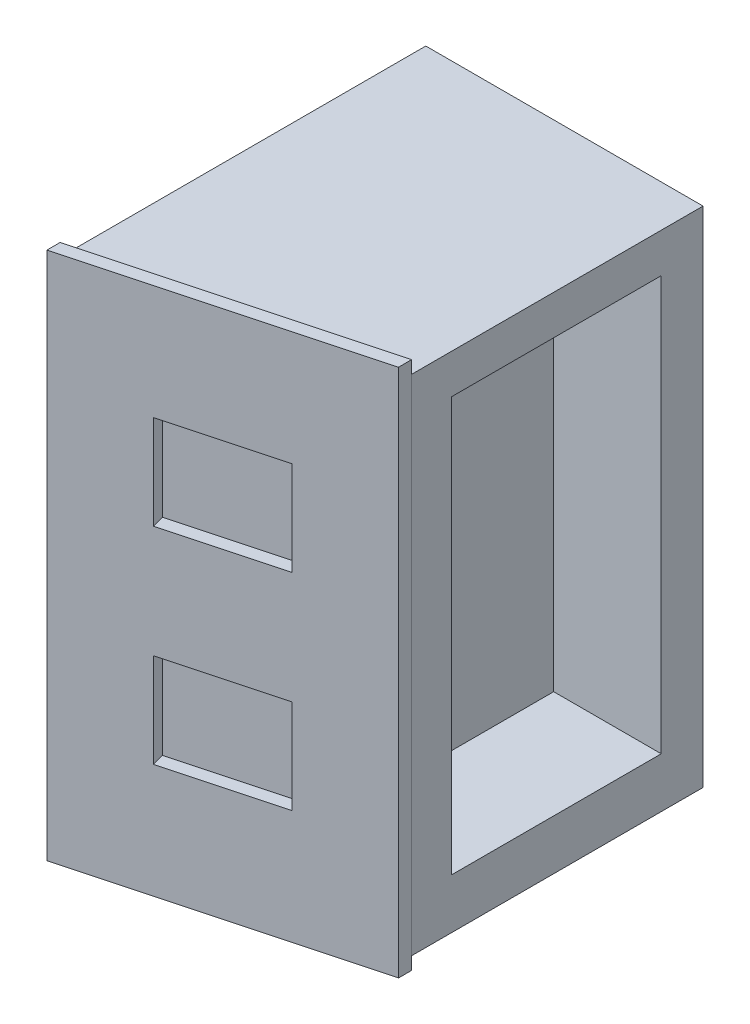
ISO-10303-21;
HEADER;
FILE_DESCRIPTION(('STEP AP214'),'2;1');
FILE_NAME('part.step','',(''),(''),'','','');
FILE_SCHEMA(('AUTOMOTIVE_DESIGN { 1 0 10303 214 1 1 1 1 }'));
ENDSEC;
DATA;
#1=APPLICATION_CONTEXT('core data for automotive mechanical design processes');
#2=APPLICATION_PROTOCOL_DEFINITION('international standard','automotive_design',2000,#1);
#3=PRODUCT_CONTEXT('',#1,'mechanical');
#4=PRODUCT('Part','Part','',(#3));
#5=PRODUCT_RELATED_PRODUCT_CATEGORY('part','',(#4));
#6=PRODUCT_DEFINITION_FORMATION('','',#4);
#7=PRODUCT_DEFINITION_CONTEXT('part definition',#1,'design');
#8=PRODUCT_DEFINITION('design','',#6,#7);
#9=PRODUCT_DEFINITION_SHAPE('','',#8);
#10=(LENGTH_UNIT() NAMED_UNIT(*) SI_UNIT(.MILLI.,.METRE.));
#11=(NAMED_UNIT(*) PLANE_ANGLE_UNIT() SI_UNIT($,.RADIAN.));
#12=(NAMED_UNIT(*) SI_UNIT($,.STERADIAN.) SOLID_ANGLE_UNIT());
#13=UNCERTAINTY_MEASURE_WITH_UNIT(LENGTH_MEASURE(1.E-05),#10,'distance_accuracy_value','');
#14=(GEOMETRIC_REPRESENTATION_CONTEXT(3) GLOBAL_UNCERTAINTY_ASSIGNED_CONTEXT((#13)) GLOBAL_UNIT_ASSIGNED_CONTEXT((#10,
#11,#12)) REPRESENTATION_CONTEXT('',''));
#15=CARTESIAN_POINT('',(0.,0.,0.));
#16=DIRECTION('',(0.,0.,1.));
#17=DIRECTION('',(1.,0.,0.));
#18=AXIS2_PLACEMENT_3D('',#15,#16,#17);
#19=CARTESIAN_POINT('',(148.067024085552,0.,552.59365681282));
#20=DIRECTION('',(-0.258819045102514,0.,-0.96592582628907));
#21=DIRECTION('',(-0.96592582628907,0.,0.258819045102514));
#22=AXIS2_PLACEMENT_3D('',#19,#20,#21);
#23=PLANE('',#22);
#24=DIRECTION('',(0.96592582628907,0.,-0.258819045102514));
#25=VECTOR('',#24,1.);
#26=CARTESIAN_POINT('',(-98.9844541522319,31.6458753119341,618.790900895548));
#27=LINE('',#26,#25);
#28=CARTESIAN_POINT('',(-227.790663087879,31.6458753119341,653.304420559968));
#29=VERTEX_POINT('',#28);
#30=CARTESIAN_POINT('',(-98.9844541522319,31.6458753119341,618.790900895548));
#31=VERTEX_POINT('',#30);
#32=EDGE_CURVE('E178',#29,#31,#27,.T.);
#33=ORIENTED_EDGE('',*,*,#32,.F.);
#34=DIRECTION('',(0.,-1.,0.));
#35=VECTOR('',#34,1.);
#36=CARTESIAN_POINT('',(-227.790663087879,31.6458753119341,653.304420559968));
#37=LINE('',#36,#35);
#38=CARTESIAN_POINT('',(-227.790663087879,142.770875311934,653.304420559968));
#39=VERTEX_POINT('',#38);
#40=EDGE_CURVE('E69',#39,#29,#37,.T.);
#41=ORIENTED_EDGE('',*,*,#40,.F.);
#42=DIRECTION('',(-0.96592582628907,0.,0.258819045102514));
#43=VECTOR('',#42,1.);
#44=CARTESIAN_POINT('',(-98.9844541522319,142.770875311934,618.790900895548));
#45=LINE('',#44,#43);
#46=CARTESIAN_POINT('',(-98.9844541522319,142.770875311934,618.790900895548));
#47=VERTEX_POINT('',#46);
#48=EDGE_CURVE('E165',#47,#39,#45,.T.);
#49=ORIENTED_EDGE('',*,*,#48,.F.);
#50=DIRECTION('',(0.,1.,0.));
#51=VECTOR('',#50,1.);
#52=CARTESIAN_POINT('',(-98.9844541522319,31.6458753119341,618.790900895548));
#53=LINE('',#52,#51);
#54=EDGE_CURVE('E169',#31,#47,#53,.T.);
#55=ORIENTED_EDGE('',*,*,#54,.F.);
#56=EDGE_LOOP('',(#33,#41,#49,#55));
#57=FACE_BOUND('',#56,.T.);
#58=DIRECTION('',(0.,-1.,0.));
#59=VECTOR('',#58,1.);
#60=CARTESIAN_POINT('',(-227.790663087879,386.381153049981,653.304420559968));
#61=LINE('',#60,#59);
#62=CARTESIAN_POINT('',(-227.790663087879,386.381153049981,653.304420559968));
#63=VERTEX_POINT('',#62);
#64=CARTESIAN_POINT('',(-227.790663087879,275.256153049981,653.304420559968));
#65=VERTEX_POINT('',#64);
#66=EDGE_CURVE('E214',#63,#65,#61,.T.);
#67=ORIENTED_EDGE('',*,*,#66,.F.);
#68=DIRECTION('',(-0.96592582628907,0.,0.258819045102514));
#69=VECTOR('',#68,1.);
#70=CARTESIAN_POINT('',(-98.9844541522319,386.381153049981,618.790900895548));
#71=LINE('',#70,#69);
#72=CARTESIAN_POINT('',(-98.9844541522319,386.381153049981,618.790900895548));
#73=VERTEX_POINT('',#72);
#74=EDGE_CURVE('E77',#73,#63,#71,.T.);
#75=ORIENTED_EDGE('',*,*,#74,.F.);
#76=DIRECTION('',(0.,1.,0.));
#77=VECTOR('',#76,1.);
#78=CARTESIAN_POINT('',(-98.9844541522319,386.381153049981,618.790900895548));
#79=LINE('',#78,#77);
#80=CARTESIAN_POINT('',(-98.9844541522319,275.256153049981,618.790900895548));
#81=VERTEX_POINT('',#80);
#82=EDGE_CURVE('E199',#81,#73,#79,.T.);
#83=ORIENTED_EDGE('',*,*,#82,.F.);
#84=DIRECTION('',(0.96592582628907,0.,-0.258819045102514));
#85=VECTOR('',#84,1.);
#86=CARTESIAN_POINT('',(-98.9844541522319,275.256153049981,618.790900895548));
#87=LINE('',#86,#85);
#88=EDGE_CURVE('E218',#65,#81,#87,.T.);
#89=ORIENTED_EDGE('',*,*,#88,.F.);
#90=EDGE_LOOP('',(#67,#75,#83,#89));
#91=FACE_BOUND('',#90,.T.);
#92=DIRECTION('',(0.,1.,0.));
#93=VECTOR('',#92,1.);
#94=CARTESIAN_POINT('',(0.305231487729533,-88.2916246880658,592.186309811581));
#95=LINE('',#94,#93);
#96=CARTESIAN_POINT('',(0.305231487729546,-103.291624688066,592.186309811581));
#97=VERTEX_POINT('',#96);
#98=CARTESIAN_POINT('',(0.305231487729534,521.318653049981,592.186309811581));
#99=VERTEX_POINT('',#98);
#100=EDGE_CURVE('E266',#97,#99,#95,.T.);
#101=ORIENTED_EDGE('',*,*,#100,.T.);
#102=DIRECTION('',(0.96592582628907,0.,-0.258819045102514));
#103=VECTOR('',#102,1.);
#104=CARTESIAN_POINT('',(-327.080348727841,521.318653049981,679.909011643935));
#105=LINE('',#104,#103);
#106=CARTESIAN_POINT('',(-327.080348727841,521.318653049981,679.909011643935));
#107=VERTEX_POINT('',#106);
#108=EDGE_CURVE('E258',#107,#99,#105,.T.);
#109=ORIENTED_EDGE('',*,*,#108,.F.);
#110=DIRECTION('',(0.,1.,0.));
#111=VECTOR('',#110,1.);
#112=CARTESIAN_POINT('',(-327.080348727841,-104.298698601254,679.909011643936));
#113=LINE('',#112,#111);
#114=CARTESIAN_POINT('',(-327.080348727841,-103.291624688066,679.909011643935));
#115=VERTEX_POINT('',#114);
#116=EDGE_CURVE('E269',#115,#107,#113,.T.);
#117=ORIENTED_EDGE('',*,*,#116,.F.);
#118=DIRECTION('',(0.96592582628907,0.,-0.258819045102514));
#119=VECTOR('',#118,1.);
#120=CARTESIAN_POINT('',(-327.080348727841,-103.291624688066,679.909011643935));
#121=LINE('',#120,#119);
#122=EDGE_CURVE('E242',#115,#97,#121,.T.);
#123=ORIENTED_EDGE('',*,*,#122,.T.);
#124=EDGE_LOOP('',(#101,#109,#117,#123));
#125=FACE_BOUND('',#124,.T.);
#126=ADVANCED_FACE('F53',(#57,#91,#125),#23,.F.);
#127=CARTESIAN_POINT('',(144.184738409015,0.,538.104769418484));
#128=DIRECTION('',(-0.258819045102514,0.,-0.96592582628907));
#129=DIRECTION('',(-0.96592582628907,0.,0.258819045102514));
#130=AXIS2_PLACEMENT_3D('',#127,#128,#129);
#131=PLANE('',#130);
#132=DIRECTION('',(0.,-1.,0.));
#133=VECTOR('',#132,1.);
#134=CARTESIAN_POINT('',(-231.672948764417,31.6458753119341,638.815533165632));
#135=LINE('',#134,#133);
#136=CARTESIAN_POINT('',(-231.672948764417,142.770875311934,638.815533165632));
#137=VERTEX_POINT('',#136);
#138=CARTESIAN_POINT('',(-231.672948764417,31.6458753119341,638.815533165632));
#139=VERTEX_POINT('',#138);
#140=EDGE_CURVE('E144',#137,#139,#135,.T.);
#141=ORIENTED_EDGE('',*,*,#140,.T.);
#142=DIRECTION('',(0.96592582628907,0.,-0.258819045102514));
#143=VECTOR('',#142,1.);
#144=CARTESIAN_POINT('',(-102.86673982877,31.6458753119341,604.302013501212));
#145=LINE('',#144,#143);
#146=CARTESIAN_POINT('',(-102.866739828769,31.6458753119341,604.302013501212));
#147=VERTEX_POINT('',#146);
#148=EDGE_CURVE('E155',#139,#147,#145,.T.);
#149=ORIENTED_EDGE('',*,*,#148,.T.);
#150=DIRECTION('',(0.,1.,0.));
#151=VECTOR('',#150,1.);
#152=CARTESIAN_POINT('',(-102.86673982877,31.6458753119341,604.302013501212));
#153=LINE('',#152,#151);
#154=CARTESIAN_POINT('',(-102.86673982877,142.770875311934,604.302013501212));
#155=VERTEX_POINT('',#154);
#156=EDGE_CURVE('E160',#147,#155,#153,.T.);
#157=ORIENTED_EDGE('',*,*,#156,.T.);
#158=DIRECTION('',(-0.96592582628907,0.,0.258819045102514));
#159=VECTOR('',#158,1.);
#160=CARTESIAN_POINT('',(-102.86673982877,142.770875311934,604.302013501212));
#161=LINE('',#160,#159);
#162=EDGE_CURVE('E151',#155,#137,#161,.T.);
#163=ORIENTED_EDGE('',*,*,#162,.T.);
#164=EDGE_LOOP('',(#141,#149,#157,#163));
#165=FACE_BOUND('',#164,.T.);
#166=DIRECTION('',(-0.96592582628907,0.,0.258819045102514));
#167=VECTOR('',#166,1.);
#168=CARTESIAN_POINT('',(-102.86673982877,386.381153049981,604.302013501212));
#169=LINE('',#168,#167);
#170=CARTESIAN_POINT('',(-102.86673982877,386.381153049981,604.302013501212));
#171=VERTEX_POINT('',#170);
#172=CARTESIAN_POINT('',(-231.672948764417,386.381153049981,638.815533165632));
#173=VERTEX_POINT('',#172);
#174=EDGE_CURVE('E194',#171,#173,#169,.T.);
#175=ORIENTED_EDGE('',*,*,#174,.T.);
#176=DIRECTION('',(0.,-1.,0.));
#177=VECTOR('',#176,1.);
#178=CARTESIAN_POINT('',(-231.672948764417,386.381153049981,638.815533165632));
#179=LINE('',#178,#177);
#180=CARTESIAN_POINT('',(-231.672948764417,275.256153049981,638.815533165632));
#181=VERTEX_POINT('',#180);
#182=EDGE_CURVE('E198',#173,#181,#179,.T.);
#183=ORIENTED_EDGE('',*,*,#182,.T.);
#184=DIRECTION('',(0.96592582628907,0.,-0.258819045102514));
#185=VECTOR('',#184,1.);
#186=CARTESIAN_POINT('',(-102.86673982877,275.256153049981,604.302013501212));
#187=LINE('',#186,#185);
#188=CARTESIAN_POINT('',(-102.86673982877,275.256153049981,604.302013501212));
#189=VERTEX_POINT('',#188);
#190=EDGE_CURVE('E203',#181,#189,#187,.T.);
#191=ORIENTED_EDGE('',*,*,#190,.T.);
#192=DIRECTION('',(0.,1.,0.));
#193=VECTOR('',#192,1.);
#194=CARTESIAN_POINT('',(-102.86673982877,386.381153049981,604.302013501212));
#195=LINE('',#194,#193);
#196=EDGE_CURVE('E207',#189,#171,#195,.T.);
#197=ORIENTED_EDGE('',*,*,#196,.T.);
#198=EDGE_LOOP('',(#175,#183,#191,#197));
#199=FACE_BOUND('',#198,.T.);
#200=DIRECTION('',(0.,1.,0.));
#201=VECTOR('',#200,1.);
#202=CARTESIAN_POINT('',(0.305231487729513,506.31865304998,576.65716710543));
#203=LINE('',#202,#201);
#204=CARTESIAN_POINT('',(0.305231487729548,-103.291624688066,576.65716710543));
#205=VERTEX_POINT('',#204);
#206=CARTESIAN_POINT('',(0.305231487729536,521.318653049981,576.65716710543));
#207=VERTEX_POINT('',#206);
#208=EDGE_CURVE('E62',#205,#207,#203,.T.);
#209=ORIENTED_EDGE('',*,*,#208,.F.);
#210=DIRECTION('',(-0.96592582628907,0.,0.258819045102514));
#211=VECTOR('',#210,1.);
#212=CARTESIAN_POINT('',(0.305231487729548,-103.291624688066,576.65716710543));
#213=LINE('',#212,#211);
#214=CARTESIAN_POINT('',(-327.080348727841,-103.291624688066,664.379868937784));
#215=VERTEX_POINT('',#214);
#216=EDGE_CURVE('E188',#205,#215,#213,.T.);
#217=ORIENTED_EDGE('',*,*,#216,.T.);
#218=DIRECTION('',(0.,-1.,0.));
#219=VECTOR('',#218,1.);
#220=CARTESIAN_POINT('',(-327.080348727841,506.31865304998,664.379868937784));
#221=LINE('',#220,#219);
#222=CARTESIAN_POINT('',(-327.080348727841,521.318653049981,664.379868937784));
#223=VERTEX_POINT('',#222);
#224=EDGE_CURVE('E12',#223,#215,#221,.T.);
#225=ORIENTED_EDGE('',*,*,#224,.F.);
#226=DIRECTION('',(-0.96592582628907,0.,0.258819045102514));
#227=VECTOR('',#226,1.);
#228=CARTESIAN_POINT('',(0.305231487729536,521.318653049981,576.65716710543));
#229=LINE('',#228,#227);
#230=EDGE_CURVE('E250',#207,#223,#229,.T.);
#231=ORIENTED_EDGE('',*,*,#230,.F.);
#232=EDGE_LOOP('',(#209,#217,#225,#231));
#233=FACE_BOUND('',#232,.T.);
#234=ADVANCED_FACE('F55',(#165,#199,#233),#131,.T.);
#235=CARTESIAN_POINT('',(-327.080348727841,-104.298698601254,664.379868937784));
#236=DIRECTION('',(1.,0.,0.));
#237=DIRECTION('',(0.,0.,-1.));
#238=AXIS2_PLACEMENT_3D('',#235,#236,#237);
#239=PLANE('',#238);
#240=ORIENTED_EDGE('',*,*,#224,.T.);
#241=DIRECTION('',(0.,0.,1.));
#242=VECTOR('',#241,1.);
#243=CARTESIAN_POINT('',(-327.080348727841,-103.291624688066,664.379868937784));
#244=LINE('',#243,#242);
#245=EDGE_CURVE('E246',#215,#115,#244,.T.);
#246=ORIENTED_EDGE('',*,*,#245,.T.);
#247=ORIENTED_EDGE('',*,*,#116,.T.);
#248=DIRECTION('',(0.,0.,1.));
#249=VECTOR('',#248,1.);
#250=CARTESIAN_POINT('',(-327.080348727841,521.318653049981,664.379868937784));
#251=LINE('',#250,#249);
#252=EDGE_CURVE('E254',#223,#107,#251,.T.);
#253=ORIENTED_EDGE('',*,*,#252,.F.);
#254=EDGE_LOOP('',(#240,#246,#247,#253));
#255=FACE_BOUND('',#254,.T.);
#256=ADVANCED_FACE('F285',(#255),#239,.F.);
#257=CARTESIAN_POINT('',(0.305231487729535,-88.2916246880658,576.65716710543));
#258=DIRECTION('',(1.,0.,0.));
#259=DIRECTION('',(0.,0.,-1.));
#260=AXIS2_PLACEMENT_3D('',#257,#258,#259);
#261=PLANE('',#260);
#262=ORIENTED_EDGE('',*,*,#208,.T.);
#263=DIRECTION('',(0.,0.,-1.));
#264=VECTOR('',#263,1.);
#265=CARTESIAN_POINT('',(0.305231487729534,521.318653049981,592.186309811581));
#266=LINE('',#265,#264);
#267=EDGE_CURVE('E262',#99,#207,#266,.T.);
#268=ORIENTED_EDGE('',*,*,#267,.F.);
#269=ORIENTED_EDGE('',*,*,#100,.F.);
#270=DIRECTION('',(0.,0.,-1.));
#271=VECTOR('',#270,1.);
#272=CARTESIAN_POINT('',(0.305231487729546,-103.291624688066,592.186309811581));
#273=LINE('',#272,#271);
#274=EDGE_CURVE('E238',#97,#205,#273,.T.);
#275=ORIENTED_EDGE('',*,*,#274,.T.);
#276=EDGE_LOOP('',(#262,#268,#269,#275));
#277=FACE_BOUND('',#276,.T.);
#278=ADVANCED_FACE('F274',(#277),#261,.T.);
#279=CARTESIAN_POINT('',(0.,521.318653049981,0.));
#280=DIRECTION('',(0.,1.,0.));
#281=DIRECTION('',(0.,0.,1.));
#282=AXIS2_PLACEMENT_3D('',#279,#280,#281);
#283=PLANE('',#282);
#284=ORIENTED_EDGE('',*,*,#230,.T.);
#285=ORIENTED_EDGE('',*,*,#252,.T.);
#286=ORIENTED_EDGE('',*,*,#108,.T.);
#287=ORIENTED_EDGE('',*,*,#267,.T.);
#288=EDGE_LOOP('',(#284,#285,#286,#287));
#289=FACE_BOUND('',#288,.T.);
#290=ADVANCED_FACE('F280',(#289),#283,.T.);
#291=CARTESIAN_POINT('',(0.,-103.291624688066,0.));
#292=DIRECTION('',(0.,-1.,0.));
#293=DIRECTION('',(0.,0.,1.));
#294=AXIS2_PLACEMENT_3D('',#291,#292,#293);
#295=PLANE('',#294);
#296=ORIENTED_EDGE('',*,*,#216,.F.);
#297=ORIENTED_EDGE('',*,*,#274,.F.);
#298=ORIENTED_EDGE('',*,*,#122,.F.);
#299=ORIENTED_EDGE('',*,*,#245,.F.);
#300=EDGE_LOOP('',(#296,#297,#298,#299));
#301=FACE_BOUND('',#300,.T.);
#302=ADVANCED_FACE('F289',(#301),#295,.T.);
#303=CARTESIAN_POINT('',(-102.86673982877,386.381153049981,604.302013501212));
#304=DIRECTION('',(0.,1.,0.));
#305=DIRECTION('',(-1.,0.,0.));
#306=AXIS2_PLACEMENT_3D('',#303,#304,#305);
#307=PLANE('',#306);
#308=ORIENTED_EDGE('',*,*,#74,.T.);
#309=DIRECTION('',(0.258819045102514,0.,0.96592582628907));
#310=VECTOR('',#309,1.);
#311=CARTESIAN_POINT('',(-231.672948764417,386.381153049981,638.815533165632));
#312=LINE('',#311,#310);
#313=EDGE_CURVE('E211',#173,#63,#312,.T.);
#314=ORIENTED_EDGE('',*,*,#313,.F.);
#315=ORIENTED_EDGE('',*,*,#174,.F.);
#316=DIRECTION('',(0.258819045102514,0.,0.96592582628907));
#317=VECTOR('',#316,1.);
#318=CARTESIAN_POINT('',(-102.86673982877,386.381153049981,604.302013501212));
#319=LINE('',#318,#317);
#320=EDGE_CURVE('E179',#171,#73,#319,.T.);
#321=ORIENTED_EDGE('',*,*,#320,.T.);
#322=EDGE_LOOP('',(#308,#314,#315,#321));
#323=FACE_BOUND('',#322,.T.);
#324=ADVANCED_FACE('F291',(#323),#307,.F.);
#325=CARTESIAN_POINT('',(-102.86673982877,386.381153049981,604.302013501212));
#326=DIRECTION('',(0.96592582628907,0.,-0.258819045102514));
#327=DIRECTION('',(-0.258819045102514,0.,-0.96592582628907));
#328=AXIS2_PLACEMENT_3D('',#325,#326,#327);
#329=PLANE('',#328);
#330=ORIENTED_EDGE('',*,*,#82,.T.);
#331=ORIENTED_EDGE('',*,*,#320,.F.);
#332=ORIENTED_EDGE('',*,*,#196,.F.);
#333=DIRECTION('',(0.258819045102514,0.,0.96592582628907));
#334=VECTOR('',#333,1.);
#335=CARTESIAN_POINT('',(-102.86673982877,275.256153049981,604.302013501212));
#336=LINE('',#335,#334);
#337=EDGE_CURVE('E227',#189,#81,#336,.T.);
#338=ORIENTED_EDGE('',*,*,#337,.T.);
#339=EDGE_LOOP('',(#330,#331,#332,#338));
#340=FACE_BOUND('',#339,.T.);
#341=ADVANCED_FACE('F297',(#340),#329,.F.);
#342=CARTESIAN_POINT('',(-102.86673982877,275.256153049981,604.302013501212));
#343=DIRECTION('',(0.,-1.,0.));
#344=DIRECTION('',(0.,0.,-1.));
#345=AXIS2_PLACEMENT_3D('',#342,#343,#344);
#346=PLANE('',#345);
#347=ORIENTED_EDGE('',*,*,#88,.T.);
#348=ORIENTED_EDGE('',*,*,#337,.F.);
#349=ORIENTED_EDGE('',*,*,#190,.F.);
#350=DIRECTION('',(0.258819045102514,0.,0.96592582628907));
#351=VECTOR('',#350,1.);
#352=CARTESIAN_POINT('',(-231.672948764417,275.256153049981,638.815533165632));
#353=LINE('',#352,#351);
#354=EDGE_CURVE('E230',#181,#65,#353,.T.);
#355=ORIENTED_EDGE('',*,*,#354,.T.);
#356=EDGE_LOOP('',(#347,#348,#349,#355));
#357=FACE_BOUND('',#356,.T.);
#358=ADVANCED_FACE('F357',(#357),#346,.F.);
#359=CARTESIAN_POINT('',(-231.672948764417,386.381153049981,638.815533165632));
#360=DIRECTION('',(-0.96592582628907,0.,0.258819045102514));
#361=DIRECTION('',(0.258819045102514,0.,0.96592582628907));
#362=AXIS2_PLACEMENT_3D('',#359,#360,#361);
#363=PLANE('',#362);
#364=ORIENTED_EDGE('',*,*,#66,.T.);
#365=ORIENTED_EDGE('',*,*,#354,.F.);
#366=ORIENTED_EDGE('',*,*,#182,.F.);
#367=ORIENTED_EDGE('',*,*,#313,.T.);
#368=EDGE_LOOP('',(#364,#365,#366,#367));
#369=FACE_BOUND('',#368,.T.);
#370=ADVANCED_FACE('F366',(#369),#363,.F.);
#371=CARTESIAN_POINT('',(-231.672948764417,31.6458753119341,638.815533165632));
#372=DIRECTION('',(-0.96592582628907,0.,0.258819045102514));
#373=DIRECTION('',(0.258819045102514,0.,0.96592582628907));
#374=AXIS2_PLACEMENT_3D('',#371,#372,#373);
#375=PLANE('',#374);
#376=ORIENTED_EDGE('',*,*,#40,.T.);
#377=DIRECTION('',(0.258819045102514,0.,0.96592582628907));
#378=VECTOR('',#377,1.);
#379=CARTESIAN_POINT('',(-231.672948764417,31.6458753119341,638.815533165632));
#380=LINE('',#379,#378);
#381=EDGE_CURVE('E140',#139,#29,#380,.T.);
#382=ORIENTED_EDGE('',*,*,#381,.F.);
#383=ORIENTED_EDGE('',*,*,#140,.F.);
#384=DIRECTION('',(0.258819045102514,0.,0.96592582628907));
#385=VECTOR('',#384,1.);
#386=CARTESIAN_POINT('',(-231.672948764417,142.770875311934,638.815533165632));
#387=LINE('',#386,#385);
#388=EDGE_CURVE('E185',#137,#39,#387,.T.);
#389=ORIENTED_EDGE('',*,*,#388,.T.);
#390=EDGE_LOOP('',(#376,#382,#383,#389));
#391=FACE_BOUND('',#390,.T.);
#392=ADVANCED_FACE('F142',(#391),#375,.F.);
#393=CARTESIAN_POINT('',(-102.86673982877,142.770875311934,604.302013501212));
#394=DIRECTION('',(0.,1.,0.));
#395=DIRECTION('',(-1.,0.,0.));
#396=AXIS2_PLACEMENT_3D('',#393,#394,#395);
#397=PLANE('',#396);
#398=ORIENTED_EDGE('',*,*,#48,.T.);
#399=ORIENTED_EDGE('',*,*,#388,.F.);
#400=ORIENTED_EDGE('',*,*,#162,.F.);
#401=DIRECTION('',(0.258819045102514,0.,0.96592582628907));
#402=VECTOR('',#401,1.);
#403=CARTESIAN_POINT('',(-102.86673982877,142.770875311934,604.302013501212));
#404=LINE('',#403,#402);
#405=EDGE_CURVE('E189',#155,#47,#404,.T.);
#406=ORIENTED_EDGE('',*,*,#405,.T.);
#407=EDGE_LOOP('',(#398,#399,#400,#406));
#408=FACE_BOUND('',#407,.T.);
#409=ADVANCED_FACE('F383',(#408),#397,.F.);
#410=CARTESIAN_POINT('',(-102.86673982877,31.6458753119341,604.302013501212));
#411=DIRECTION('',(0.96592582628907,0.,-0.258819045102514));
#412=DIRECTION('',(-0.258819045102514,0.,-0.96592582628907));
#413=AXIS2_PLACEMENT_3D('',#410,#411,#412);
#414=PLANE('',#413);
#415=ORIENTED_EDGE('',*,*,#54,.T.);
#416=ORIENTED_EDGE('',*,*,#405,.F.);
#417=ORIENTED_EDGE('',*,*,#156,.F.);
#418=DIRECTION('',(0.258819045102514,0.,0.96592582628907));
#419=VECTOR('',#418,1.);
#420=CARTESIAN_POINT('',(-102.86673982877,31.6458753119341,604.302013501212));
#421=LINE('',#420,#419);
#422=EDGE_CURVE('E150',#147,#31,#421,.T.);
#423=ORIENTED_EDGE('',*,*,#422,.T.);
#424=EDGE_LOOP('',(#415,#416,#417,#423));
#425=FACE_BOUND('',#424,.T.);
#426=ADVANCED_FACE('F391',(#425),#414,.F.);
#427=CARTESIAN_POINT('',(-102.86673982877,31.6458753119341,604.302013501212));
#428=DIRECTION('',(0.,-1.,0.));
#429=DIRECTION('',(0.,0.,-1.));
#430=AXIS2_PLACEMENT_3D('',#427,#428,#429);
#431=PLANE('',#430);
#432=ORIENTED_EDGE('',*,*,#32,.T.);
#433=ORIENTED_EDGE('',*,*,#422,.F.);
#434=ORIENTED_EDGE('',*,*,#148,.F.);
#435=ORIENTED_EDGE('',*,*,#381,.T.);
#436=EDGE_LOOP('',(#432,#433,#434,#435));
#437=FACE_BOUND('',#436,.T.);
#438=ADVANCED_FACE('F156',(#437),#431,.F.);
#439=CLOSED_SHELL('',(#126,#234,#256,#278,#290,#302,#324,#341,#358,#370,#392,#409,#426,#438));
#440=MANIFOLD_SOLID_BREP('B2',#439);
#441=CARTESIAN_POINT('',(-327.080348727841,506.318653049981,232.579868937784));
#442=DIRECTION('',(1.,0.,0.));
#443=DIRECTION('',(0.,0.,-1.));
#444=AXIS2_PLACEMENT_3D('',#441,#442,#443);
#445=PLANE('',#444);
#446=DIRECTION('',(0.,0.,-1.));
#447=VECTOR('',#446,1.);
#448=CARTESIAN_POINT('',(-327.080348727841,21.2583753119342,573.479868937784));
#449=LINE('',#448,#447);
#450=CARTESIAN_POINT('',(-327.080348727841,21.2583753119341,573.479868937784));
#451=VERTEX_POINT('',#450);
#452=CARTESIAN_POINT('',(-327.080348727841,21.2583753119342,323.479868937785));
#453=VERTEX_POINT('',#452);
#454=EDGE_CURVE('E647',#451,#453,#449,.T.);
#455=ORIENTED_EDGE('',*,*,#454,.T.);
#456=DIRECTION('',(0.,1.,0.));
#457=VECTOR('',#456,1.);
#458=CARTESIAN_POINT('',(-327.080348727841,221.258375311934,323.479868937785));
#459=LINE('',#458,#457);
#460=CARTESIAN_POINT('',(-327.080348727841,221.258375311934,323.479868937785));
#461=VERTEX_POINT('',#460);
#462=EDGE_CURVE('E667',#453,#461,#459,.T.);
#463=ORIENTED_EDGE('',*,*,#462,.T.);
#464=DIRECTION('',(0.,0.,1.));
#465=VECTOR('',#464,1.);
#466=CARTESIAN_POINT('',(-327.080348727841,221.258375311934,573.479868937784));
#467=LINE('',#466,#465);
#468=CARTESIAN_POINT('',(-327.080348727841,221.258375311934,573.479868937784));
#469=VERTEX_POINT('',#468);
#470=EDGE_CURVE('E670',#461,#469,#467,.T.);
#471=ORIENTED_EDGE('',*,*,#470,.T.);
#472=DIRECTION('',(0.,-1.,0.));
#473=VECTOR('',#472,1.);
#474=CARTESIAN_POINT('',(-327.080348727841,221.258375311934,573.479868937784));
#475=LINE('',#474,#473);
#476=EDGE_CURVE('E658',#469,#451,#475,.T.);
#477=ORIENTED_EDGE('',*,*,#476,.T.);
#478=EDGE_LOOP('',(#455,#463,#471,#477));
#479=FACE_BOUND('',#478,.T.);
#480=DIRECTION('',(0.,0.,1.));
#481=VECTOR('',#480,1.);
#482=CARTESIAN_POINT('',(-327.080348727841,350.023375311934,498.479868937784));
#483=LINE('',#482,#481);
#484=CARTESIAN_POINT('',(-327.080348727841,350.023375311934,398.479868937784));
#485=VERTEX_POINT('',#484);
#486=CARTESIAN_POINT('',(-327.080348727841,350.023375311934,498.479868937784));
#487=VERTEX_POINT('',#486);
#488=EDGE_CURVE('E637',#485,#487,#483,.T.);
#489=ORIENTED_EDGE('',*,*,#488,.F.);
#490=DIRECTION('',(0.,-1.,0.));
#491=VECTOR('',#490,1.);
#492=CARTESIAN_POINT('',(-327.080348727841,350.023375311934,398.479868937784));
#493=LINE('',#492,#491);
#494=CARTESIAN_POINT('',(-327.080348727841,450.023375311934,398.479868937784));
#495=VERTEX_POINT('',#494);
#496=EDGE_CURVE('E620',#495,#485,#493,.T.);
#497=ORIENTED_EDGE('',*,*,#496,.F.);
#498=DIRECTION('',(0.,0.,-1.));
#499=VECTOR('',#498,1.);
#500=CARTESIAN_POINT('',(-327.080348727841,450.023375311934,498.479868937784));
#501=LINE('',#500,#499);
#502=CARTESIAN_POINT('',(-327.080348727841,450.023375311934,498.479868937784));
#503=VERTEX_POINT('',#502);
#504=EDGE_CURVE('E626',#503,#495,#501,.T.);
#505=ORIENTED_EDGE('',*,*,#504,.F.);
#506=DIRECTION('',(0.,1.,0.));
#507=VECTOR('',#506,1.);
#508=CARTESIAN_POINT('',(-327.080348727841,350.023375311934,498.479868937784));
#509=LINE('',#508,#507);
#510=EDGE_CURVE('E640',#487,#503,#509,.T.);
#511=ORIENTED_EDGE('',*,*,#510,.F.);
#512=EDGE_LOOP('',(#489,#497,#505,#511));
#513=FACE_BOUND('',#512,.T.);
#514=DIRECTION('',(0.,-0.694746590606866,-0.719254596676403));
#515=VECTOR('',#514,1.);
#516=CARTESIAN_POINT('',(-327.080348727841,42.0707727069249,681.008886361099));
#517=LINE('',#516,#515);
#518=CARTESIAN_POINT('',(-327.080348727841,26.0083753119342,664.379868937784));
#519=VERTEX_POINT('',#518);
#520=CARTESIAN_POINT('',(-327.080348727841,-88.2916246880659,546.047801516912));
#521=VERTEX_POINT('',#520);
#522=EDGE_CURVE('E605',#519,#521,#517,.T.);
#523=ORIENTED_EDGE('',*,*,#522,.F.);
#524=DIRECTION('',(0.,-1.,0.));
#525=VECTOR('',#524,1.);
#526=CARTESIAN_POINT('',(-327.080348727841,506.318653049981,664.379868937784));
#527=LINE('',#526,#525);
#528=CARTESIAN_POINT('',(-327.080348727841,506.318653049981,664.379868937784));
#529=VERTEX_POINT('',#528);
#530=EDGE_CURVE('E51',#529,#519,#527,.T.);
#531=ORIENTED_EDGE('',*,*,#530,.F.);
#532=DIRECTION('',(0.,0.,1.));
#533=VECTOR('',#532,1.);
#534=CARTESIAN_POINT('',(-327.080348727841,506.318653049981,232.579868937784));
#535=LINE('',#534,#533);
#536=CARTESIAN_POINT('',(-327.080348727841,506.318653049981,232.579868937784));
#537=VERTEX_POINT('',#536);
#538=EDGE_CURVE('E717',#537,#529,#535,.T.);
#539=ORIENTED_EDGE('',*,*,#538,.F.);
#540=DIRECTION('',(0.,-1.,0.));
#541=VECTOR('',#540,1.);
#542=CARTESIAN_POINT('',(-327.080348727841,506.318653049981,232.579868937784));
#543=LINE('',#542,#541);
#544=CARTESIAN_POINT('',(-327.080348727841,26.0083753119342,232.579868937784));
#545=VERTEX_POINT('',#544);
#546=EDGE_CURVE('E727',#537,#545,#543,.T.);
#547=ORIENTED_EDGE('',*,*,#546,.T.);
#548=DIRECTION('',(0.,0.707106781186548,-0.707106781186548));
#549=VECTOR('',#548,1.);
#550=CARTESIAN_POINT('',(-327.080348727841,26.0083753119342,232.579868937784));
#551=LINE('',#550,#549);
#552=CARTESIAN_POINT('',(-327.080348727841,-88.2916246880658,346.879868937784));
#553=VERTEX_POINT('',#552);
#554=EDGE_CURVE('E609',#553,#545,#551,.T.);
#555=ORIENTED_EDGE('',*,*,#554,.F.);
#556=DIRECTION('',(0.,0.,1.));
#557=VECTOR('',#556,1.);
#558=CARTESIAN_POINT('',(-327.080348727841,-88.2916246880658,232.579868937784));
#559=LINE('',#558,#557);
#560=EDGE_CURVE('E710',#553,#521,#559,.T.);
#561=ORIENTED_EDGE('',*,*,#560,.T.);
#562=EDGE_LOOP('',(#523,#531,#539,#547,#555,#561));
#563=FACE_BOUND('',#562,.T.);
#564=ADVANCED_FACE('F452',(#479,#513,#563),#445,.F.);
#565=CARTESIAN_POINT('',(-327.080348727841,506.318653049981,664.379868937784));
#566=DIRECTION('',(-0.258819045102518,0.,-0.965925826289069));
#567=DIRECTION('',(-0.965925826289069,0.,0.258819045102518));
#568=AXIS2_PLACEMENT_3D('',#565,#566,#567);
#569=PLANE('',#568);
#570=DIRECTION('',(-0.965925826289069,0.,0.258819045102518));
#571=VECTOR('',#570,1.);
#572=CARTESIAN_POINT('',(-143.554441732918,26.0083753119342,615.204250368306));
#573=LINE('',#572,#571);
#574=CARTESIAN_POINT('',(-143.554441732918,26.0083753119342,615.204250368306));
#575=VERTEX_POINT('',#574);
#576=EDGE_CURVE('E590',#575,#519,#573,.T.);
#577=ORIENTED_EDGE('',*,*,#576,.F.);
#578=DIRECTION('',(0.,-1.,0.));
#579=VECTOR('',#578,1.);
#580=CARTESIAN_POINT('',(-143.554441732918,-88.2916246880658,615.204250368306));
#581=LINE('',#580,#579);
#582=CARTESIAN_POINT('',(-143.554441732918,-88.2916246880658,615.204250368306));
#583=VERTEX_POINT('',#582);
#584=EDGE_CURVE('E594',#575,#583,#581,.T.);
#585=ORIENTED_EDGE('',*,*,#584,.T.);
#586=DIRECTION('',(0.965925826289069,0.,-0.258819045102518));
#587=VECTOR('',#586,1.);
#588=CARTESIAN_POINT('',(-327.080348727841,-88.2916246880658,664.379868937784));
#589=LINE('',#588,#587);
#590=CARTESIAN_POINT('',(0.305231487729651,-88.2916246880658,576.657167105429));
#591=VERTEX_POINT('',#590);
#592=EDGE_CURVE('E730',#583,#591,#589,.T.);
#593=ORIENTED_EDGE('',*,*,#592,.T.);
#594=DIRECTION('',(0.,-1.,0.));
#595=VECTOR('',#594,1.);
#596=CARTESIAN_POINT('',(0.305231487729651,506.318653049981,576.657167105429));
#597=LINE('',#596,#595);
#598=CARTESIAN_POINT('',(0.305231487729651,506.318653049981,576.657167105429));
#599=VERTEX_POINT('',#598);
#600=EDGE_CURVE('E459',#599,#591,#597,.T.);
#601=ORIENTED_EDGE('',*,*,#600,.F.);
#602=DIRECTION('',(0.965925826289069,0.,-0.258819045102518));
#603=VECTOR('',#602,1.);
#604=CARTESIAN_POINT('',(-327.080348727841,506.318653049981,664.379868937784));
#605=LINE('',#604,#603);
#606=EDGE_CURVE('E720',#529,#599,#605,.T.);
#607=ORIENTED_EDGE('',*,*,#606,.F.);
#608=ORIENTED_EDGE('',*,*,#530,.T.);
#609=EDGE_LOOP('',(#577,#585,#593,#601,#607,#608));
#610=FACE_BOUND('',#609,.T.);
#611=ADVANCED_FACE('F602',(#610),#569,.F.);
#612=CARTESIAN_POINT('',(-327.080348727841,-88.2916246880658,232.579868937784));
#613=DIRECTION('',(0.,-1.,0.));
#614=DIRECTION('',(0.,0.,-1.));
#615=AXIS2_PLACEMENT_3D('',#612,#613,#614);
#616=PLANE('',#615);
#617=DIRECTION('',(-0.258819045102518,0.,-0.965925826289069));
#618=VECTOR('',#617,1.);
#619=CARTESIAN_POINT('',(-173.137458588136,-88.2916246880659,504.798928423465));
#620=LINE('',#619,#618);
#621=CARTESIAN_POINT('',(-173.137458588136,-88.2916246880658,504.798928423465));
#622=VERTEX_POINT('',#621);
#623=EDGE_CURVE('E595',#583,#622,#620,.T.);
#624=ORIENTED_EDGE('',*,*,#623,.T.);
#625=DIRECTION('',(-0.965925826289069,0.,0.258819045102518));
#626=VECTOR('',#625,1.);
#627=CARTESIAN_POINT('',(-173.137458588136,-88.2916246880659,504.798928423465));
#628=LINE('',#627,#626);
#629=EDGE_CURVE('E466',#622,#521,#628,.T.);
#630=ORIENTED_EDGE('',*,*,#629,.T.);
#631=ORIENTED_EDGE('',*,*,#560,.F.);
#632=DIRECTION('',(-1.,0.,0.));
#633=VECTOR('',#632,1.);
#634=CARTESIAN_POINT('',(-155.080348727841,-88.2916246880658,346.879868937784));
#635=LINE('',#634,#633);
#636=CARTESIAN_POINT('',(-155.080348727841,-88.2916246880658,346.879868937784));
#637=VERTEX_POINT('',#636);
#638=EDGE_CURVE('E615',#637,#553,#635,.T.);
#639=ORIENTED_EDGE('',*,*,#638,.F.);
#640=DIRECTION('',(0.,0.,1.));
#641=VECTOR('',#640,1.);
#642=CARTESIAN_POINT('',(-155.080348727841,-88.2916246880658,346.879868937784));
#643=LINE('',#642,#641);
#644=CARTESIAN_POINT('',(-155.080348727841,-88.2916246880658,232.579868937784));
#645=VERTEX_POINT('',#644);
#646=EDGE_CURVE('E611',#645,#637,#643,.T.);
#647=ORIENTED_EDGE('',*,*,#646,.F.);
#648=DIRECTION('',(-1.,0.,0.));
#649=VECTOR('',#648,1.);
#650=CARTESIAN_POINT('',(0.305231487729651,-88.2916246880658,232.579868937784));
#651=LINE('',#650,#649);
#652=CARTESIAN_POINT('',(0.305231487729651,-88.2916246880658,232.579868937784));
#653=VERTEX_POINT('',#652);
#654=EDGE_CURVE('E721',#653,#645,#651,.T.);
#655=ORIENTED_EDGE('',*,*,#654,.F.);
#656=DIRECTION('',(0.,0.,-1.));
#657=VECTOR('',#656,1.);
#658=CARTESIAN_POINT('',(0.305231487729651,-88.2916246880658,576.657167105429));
#659=LINE('',#658,#657);
#660=EDGE_CURVE('E732',#591,#653,#659,.T.);
#661=ORIENTED_EDGE('',*,*,#660,.F.);
#662=ORIENTED_EDGE('',*,*,#592,.F.);
#663=EDGE_LOOP('',(#624,#630,#631,#639,#647,#655,#661,#662));
#664=FACE_BOUND('',#663,.T.);
#665=ADVANCED_FACE('F749',(#664),#616,.T.);
#666=CARTESIAN_POINT('',(0.305231487729651,506.318653049981,576.657167105429));
#667=DIRECTION('',(-1.,0.,0.));
#668=DIRECTION('',(0.,0.,1.));
#669=AXIS2_PLACEMENT_3D('',#666,#667,#668);
#670=PLANE('',#669);
#671=DIRECTION('',(0.,0.,-1.));
#672=VECTOR('',#671,1.);
#673=CARTESIAN_POINT('',(0.305231487729651,-29.1371492785861,281.926314259797));
#674=LINE('',#673,#672);
#675=CARTESIAN_POINT('',(0.305231487729651,-29.1371492785861,529.576314259797));
#676=VERTEX_POINT('',#675);
#677=CARTESIAN_POINT('',(0.305231487729651,-29.1371492785861,281.926314259797));
#678=VERTEX_POINT('',#677);
#679=EDGE_CURVE('E700',#676,#678,#674,.T.);
#680=ORIENTED_EDGE('',*,*,#679,.F.);
#681=DIRECTION('',(0.,-1.,0.));
#682=VECTOR('',#681,1.);
#683=CARTESIAN_POINT('',(0.305231487729651,-29.1371492785862,529.576314259797));
#684=LINE('',#683,#682);
#685=CARTESIAN_POINT('',(0.305231487729651,459.812850721414,529.576314259797));
#686=VERTEX_POINT('',#685);
#687=EDGE_CURVE('E684',#686,#676,#684,.T.);
#688=ORIENTED_EDGE('',*,*,#687,.F.);
#689=DIRECTION('',(0.,0.,1.));
#690=VECTOR('',#689,1.);
#691=CARTESIAN_POINT('',(0.305231487729651,459.812850721414,281.926314259797));
#692=LINE('',#691,#690);
#693=CARTESIAN_POINT('',(0.305231487729651,459.812850721414,281.926314259797));
#694=VERTEX_POINT('',#693);
#695=EDGE_CURVE('E689',#694,#686,#692,.T.);
#696=ORIENTED_EDGE('',*,*,#695,.F.);
#697=DIRECTION('',(0.,1.,0.));
#698=VECTOR('',#697,1.);
#699=CARTESIAN_POINT('',(0.305231487729651,-29.1371492785861,281.926314259797));
#700=LINE('',#699,#698);
#701=EDGE_CURVE('E703',#678,#694,#700,.T.);
#702=ORIENTED_EDGE('',*,*,#701,.F.);
#703=EDGE_LOOP('',(#680,#688,#696,#702));
#704=FACE_BOUND('',#703,.T.);
#705=ORIENTED_EDGE('',*,*,#660,.T.);
#706=DIRECTION('',(0.,-1.,0.));
#707=VECTOR('',#706,1.);
#708=CARTESIAN_POINT('',(0.305231487729651,506.318653049981,232.579868937784));
#709=LINE('',#708,#707);
#710=CARTESIAN_POINT('',(0.305231487729651,506.318653049981,232.579868937784));
#711=VERTEX_POINT('',#710);
#712=EDGE_CURVE('E738',#711,#653,#709,.T.);
#713=ORIENTED_EDGE('',*,*,#712,.F.);
#714=DIRECTION('',(0.,0.,-1.));
#715=VECTOR('',#714,1.);
#716=CARTESIAN_POINT('',(0.305231487729651,506.318653049981,576.657167105429));
#717=LINE('',#716,#715);
#718=EDGE_CURVE('E723',#599,#711,#717,.T.);
#719=ORIENTED_EDGE('',*,*,#718,.F.);
#720=ORIENTED_EDGE('',*,*,#600,.T.);
#721=EDGE_LOOP('',(#705,#713,#719,#720));
#722=FACE_BOUND('',#721,.T.);
#723=ADVANCED_FACE('F745',(#704,#722),#670,.F.);
#724=CARTESIAN_POINT('',(0.305231487729651,506.318653049981,232.579868937784));
#725=DIRECTION('',(0.,0.,1.));
#726=DIRECTION('',(1.,0.,0.));
#727=AXIS2_PLACEMENT_3D('',#724,#725,#726);
#728=PLANE('',#727);
#729=DIRECTION('',(0.,-1.,0.));
#730=VECTOR('',#729,1.);
#731=CARTESIAN_POINT('',(-155.080348727841,-88.2916246880658,232.579868937784));
#732=LINE('',#731,#730);
#733=CARTESIAN_POINT('',(-155.080348727841,26.0083753119342,232.579868937784));
#734=VERTEX_POINT('',#733);
#735=EDGE_CURVE('E474',#734,#645,#732,.T.);
#736=ORIENTED_EDGE('',*,*,#735,.F.);
#737=DIRECTION('',(-1.,0.,0.));
#738=VECTOR('',#737,1.);
#739=CARTESIAN_POINT('',(-155.080348727841,26.0083753119342,232.579868937784));
#740=LINE('',#739,#738);
#741=EDGE_CURVE('E617',#734,#545,#740,.T.);
#742=ORIENTED_EDGE('',*,*,#741,.T.);
#743=ORIENTED_EDGE('',*,*,#546,.F.);
#744=DIRECTION('',(-1.,0.,0.));
#745=VECTOR('',#744,1.);
#746=CARTESIAN_POINT('',(0.305231487729651,506.318653049981,232.579868937784));
#747=LINE('',#746,#745);
#748=EDGE_CURVE('E725',#711,#537,#747,.T.);
#749=ORIENTED_EDGE('',*,*,#748,.F.);
#750=ORIENTED_EDGE('',*,*,#712,.T.);
#751=ORIENTED_EDGE('',*,*,#654,.T.);
#752=EDGE_LOOP('',(#736,#742,#743,#749,#750,#751));
#753=FACE_BOUND('',#752,.T.);
#754=ADVANCED_FACE('F752',(#753),#728,.F.);
#755=CARTESIAN_POINT('',(-327.080348727841,506.318653049981,232.579868937784));
#756=DIRECTION('',(0.,-1.,0.));
#757=DIRECTION('',(0.,0.,-1.));
#758=AXIS2_PLACEMENT_3D('',#755,#756,#757);
#759=PLANE('',#758);
#760=ORIENTED_EDGE('',*,*,#538,.T.);
#761=ORIENTED_EDGE('',*,*,#606,.T.);
#762=ORIENTED_EDGE('',*,*,#718,.T.);
#763=ORIENTED_EDGE('',*,*,#748,.T.);
#764=EDGE_LOOP('',(#760,#761,#762,#763));
#765=FACE_BOUND('',#764,.T.);
#766=ADVANCED_FACE('F757',(#765),#759,.F.);
#767=CARTESIAN_POINT('',(-126.69476851227,-29.1371492785862,529.576314259797));
#768=DIRECTION('',(0.,0.,1.));
#769=DIRECTION('',(1.,0.,0.));
#770=AXIS2_PLACEMENT_3D('',#767,#768,#769);
#771=PLANE('',#770);
#772=ORIENTED_EDGE('',*,*,#687,.T.);
#773=DIRECTION('',(1.,0.,0.));
#774=VECTOR('',#773,1.);
#775=CARTESIAN_POINT('',(-126.69476851227,-29.1371492785862,529.576314259797));
#776=LINE('',#775,#774);
#777=CARTESIAN_POINT('',(-126.69476851227,-29.1371492785862,529.576314259797));
#778=VERTEX_POINT('',#777);
#779=EDGE_CURVE('E698',#778,#676,#776,.T.);
#780=ORIENTED_EDGE('',*,*,#779,.F.);
#781=DIRECTION('',(0.,-1.,0.));
#782=VECTOR('',#781,1.);
#783=CARTESIAN_POINT('',(-126.69476851227,-29.1371492785862,529.576314259797));
#784=LINE('',#783,#782);
#785=CARTESIAN_POINT('',(-126.69476851227,459.812850721414,529.576314259797));
#786=VERTEX_POINT('',#785);
#787=EDGE_CURVE('E685',#786,#778,#784,.T.);
#788=ORIENTED_EDGE('',*,*,#787,.F.);
#789=DIRECTION('',(1.,0.,0.));
#790=VECTOR('',#789,1.);
#791=CARTESIAN_POINT('',(-126.69476851227,459.812850721414,529.576314259797));
#792=LINE('',#791,#790);
#793=EDGE_CURVE('E708',#786,#686,#792,.T.);
#794=ORIENTED_EDGE('',*,*,#793,.T.);
#795=EDGE_LOOP('',(#772,#780,#788,#794));
#796=FACE_BOUND('',#795,.T.);
#797=ADVANCED_FACE('F840',(#796),#771,.F.);
#798=CARTESIAN_POINT('',(-126.69476851227,459.812850721414,281.926314259797));
#799=DIRECTION('',(0.,1.,0.));
#800=DIRECTION('',(0.,0.,1.));
#801=AXIS2_PLACEMENT_3D('',#798,#799,#800);
#802=PLANE('',#801);
#803=ORIENTED_EDGE('',*,*,#695,.T.);
#804=ORIENTED_EDGE('',*,*,#793,.F.);
#805=DIRECTION('',(0.,0.,1.));
#806=VECTOR('',#805,1.);
#807=CARTESIAN_POINT('',(-126.69476851227,459.812850721414,281.926314259797));
#808=LINE('',#807,#806);
#809=CARTESIAN_POINT('',(-126.69476851227,459.812850721414,281.926314259797));
#810=VERTEX_POINT('',#809);
#811=EDGE_CURVE('E695',#810,#786,#808,.T.);
#812=ORIENTED_EDGE('',*,*,#811,.F.);
#813=DIRECTION('',(1.,0.,0.));
#814=VECTOR('',#813,1.);
#815=CARTESIAN_POINT('',(-126.69476851227,459.812850721414,281.926314259797));
#816=LINE('',#815,#814);
#817=EDGE_CURVE('E711',#810,#694,#816,.T.);
#818=ORIENTED_EDGE('',*,*,#817,.T.);
#819=EDGE_LOOP('',(#803,#804,#812,#818));
#820=FACE_BOUND('',#819,.T.);
#821=ADVANCED_FACE('F836',(#820),#802,.F.);
#822=CARTESIAN_POINT('',(-126.69476851227,-29.1371492785861,281.926314259797));
#823=DIRECTION('',(0.,0.,-1.));
#824=DIRECTION('',(-1.,0.,0.));
#825=AXIS2_PLACEMENT_3D('',#822,#823,#824);
#826=PLANE('',#825);
#827=ORIENTED_EDGE('',*,*,#701,.T.);
#828=ORIENTED_EDGE('',*,*,#817,.F.);
#829=DIRECTION('',(0.,1.,0.));
#830=VECTOR('',#829,1.);
#831=CARTESIAN_POINT('',(-126.69476851227,-29.1371492785861,281.926314259797));
#832=LINE('',#831,#830);
#833=CARTESIAN_POINT('',(-126.69476851227,-29.1371492785861,281.926314259797));
#834=VERTEX_POINT('',#833);
#835=EDGE_CURVE('E692',#834,#810,#832,.T.);
#836=ORIENTED_EDGE('',*,*,#835,.F.);
#837=DIRECTION('',(1.,0.,0.));
#838=VECTOR('',#837,1.);
#839=CARTESIAN_POINT('',(-126.69476851227,-29.1371492785861,281.926314259797));
#840=LINE('',#839,#838);
#841=EDGE_CURVE('E713',#834,#678,#840,.T.);
#842=ORIENTED_EDGE('',*,*,#841,.T.);
#843=EDGE_LOOP('',(#827,#828,#836,#842));
#844=FACE_BOUND('',#843,.T.);
#845=ADVANCED_FACE('F839',(#844),#826,.F.);
#846=CARTESIAN_POINT('',(-126.69476851227,-29.1371492785861,281.926314259797));
#847=DIRECTION('',(0.,-1.,0.));
#848=DIRECTION('',(0.,0.,-1.));
#849=AXIS2_PLACEMENT_3D('',#846,#847,#848);
#850=PLANE('',#849);
#851=ORIENTED_EDGE('',*,*,#679,.T.);
#852=ORIENTED_EDGE('',*,*,#841,.F.);
#853=DIRECTION('',(0.,0.,-1.));
#854=VECTOR('',#853,1.);
#855=CARTESIAN_POINT('',(-126.69476851227,-29.1371492785861,281.926314259797));
#856=LINE('',#855,#854);
#857=EDGE_CURVE('E688',#778,#834,#856,.T.);
#858=ORIENTED_EDGE('',*,*,#857,.F.);
#859=ORIENTED_EDGE('',*,*,#779,.T.);
#860=EDGE_LOOP('',(#851,#852,#858,#859));
#861=FACE_BOUND('',#860,.T.);
#862=ADVANCED_FACE('F834',(#861),#850,.F.);
#863=CARTESIAN_POINT('',(-126.69476851227,-88.2916246880658,232.579868937784));
#864=DIRECTION('',(1.,0.,0.));
#865=DIRECTION('',(0.,0.,-1.));
#866=AXIS2_PLACEMENT_3D('',#863,#864,#865);
#867=PLANE('',#866);
#868=ORIENTED_EDGE('',*,*,#787,.T.);
#869=ORIENTED_EDGE('',*,*,#857,.T.);
#870=ORIENTED_EDGE('',*,*,#835,.T.);
#871=ORIENTED_EDGE('',*,*,#811,.T.);
#872=EDGE_LOOP('',(#868,#869,#870,#871));
#873=FACE_BOUND('',#872,.T.);
#874=ADVANCED_FACE('F830',(#873),#867,.T.);
#875=CARTESIAN_POINT('',(-227.080348727841,21.2583753119342,573.479868937784));
#876=DIRECTION('',(0.,1.,0.));
#877=DIRECTION('',(0.,0.,1.));
#878=AXIS2_PLACEMENT_3D('',#875,#876,#877);
#879=PLANE('',#878);
#880=ORIENTED_EDGE('',*,*,#454,.F.);
#881=DIRECTION('',(-1.,0.,0.));
#882=VECTOR('',#881,1.);
#883=CARTESIAN_POINT('',(-227.080348727841,21.2583753119342,573.479868937784));
#884=LINE('',#883,#882);
#885=CARTESIAN_POINT('',(-227.080348727841,21.2583753119342,573.479868937784));
#886=VERTEX_POINT('',#885);
#887=EDGE_CURVE('E664',#886,#451,#884,.T.);
#888=ORIENTED_EDGE('',*,*,#887,.F.);
#889=DIRECTION('',(0.,0.,-1.));
#890=VECTOR('',#889,1.);
#891=CARTESIAN_POINT('',(-227.080348727841,21.2583753119342,573.479868937784));
#892=LINE('',#891,#890);
#893=CARTESIAN_POINT('',(-227.080348727841,21.2583753119342,323.479868937785));
#894=VERTEX_POINT('',#893);
#895=EDGE_CURVE('E654',#886,#894,#892,.T.);
#896=ORIENTED_EDGE('',*,*,#895,.T.);
#897=DIRECTION('',(-1.,0.,0.));
#898=VECTOR('',#897,1.);
#899=CARTESIAN_POINT('',(-227.080348727841,21.2583753119342,323.479868937785));
#900=LINE('',#899,#898);
#901=EDGE_CURVE('E681',#894,#453,#900,.T.);
#902=ORIENTED_EDGE('',*,*,#901,.T.);
#903=EDGE_LOOP('',(#880,#888,#896,#902));
#904=FACE_BOUND('',#903,.T.);
#905=ADVANCED_FACE('F826',(#904),#879,.T.);
#906=CARTESIAN_POINT('',(-227.080348727841,221.258375311934,323.479868937785));
#907=DIRECTION('',(0.,0.,1.));
#908=DIRECTION('',(1.,0.,0.));
#909=AXIS2_PLACEMENT_3D('',#906,#907,#908);
#910=PLANE('',#909);
#911=ORIENTED_EDGE('',*,*,#462,.F.);
#912=ORIENTED_EDGE('',*,*,#901,.F.);
#913=DIRECTION('',(0.,1.,0.));
#914=VECTOR('',#913,1.);
#915=CARTESIAN_POINT('',(-227.080348727841,221.258375311934,323.479868937785));
#916=LINE('',#915,#914);
#917=CARTESIAN_POINT('',(-227.080348727841,221.258375311934,323.479868937785));
#918=VERTEX_POINT('',#917);
#919=EDGE_CURVE('E657',#894,#918,#916,.T.);
#920=ORIENTED_EDGE('',*,*,#919,.T.);
#921=DIRECTION('',(-1.,0.,0.));
#922=VECTOR('',#921,1.);
#923=CARTESIAN_POINT('',(-227.080348727841,221.258375311934,323.479868937785));
#924=LINE('',#923,#922);
#925=EDGE_CURVE('E679',#918,#461,#924,.T.);
#926=ORIENTED_EDGE('',*,*,#925,.T.);
#927=EDGE_LOOP('',(#911,#912,#920,#926));
#928=FACE_BOUND('',#927,.T.);
#929=ADVANCED_FACE('F822',(#928),#910,.T.);
#930=CARTESIAN_POINT('',(-227.080348727841,221.258375311934,573.479868937784));
#931=DIRECTION('',(0.,-1.,0.));
#932=DIRECTION('',(0.,0.,-1.));
#933=AXIS2_PLACEMENT_3D('',#930,#931,#932);
#934=PLANE('',#933);
#935=ORIENTED_EDGE('',*,*,#470,.F.);
#936=ORIENTED_EDGE('',*,*,#925,.F.);
#937=DIRECTION('',(0.,0.,1.));
#938=VECTOR('',#937,1.);
#939=CARTESIAN_POINT('',(-227.080348727841,221.258375311934,573.479868937784));
#940=LINE('',#939,#938);
#941=CARTESIAN_POINT('',(-227.080348727841,221.258375311934,573.479868937784));
#942=VERTEX_POINT('',#941);
#943=EDGE_CURVE('E660',#918,#942,#940,.T.);
#944=ORIENTED_EDGE('',*,*,#943,.T.);
#945=DIRECTION('',(-1.,0.,0.));
#946=VECTOR('',#945,1.);
#947=CARTESIAN_POINT('',(-227.080348727841,221.258375311934,573.479868937784));
#948=LINE('',#947,#946);
#949=EDGE_CURVE('E677',#942,#469,#948,.T.);
#950=ORIENTED_EDGE('',*,*,#949,.T.);
#951=EDGE_LOOP('',(#935,#936,#944,#950));
#952=FACE_BOUND('',#951,.T.);
#953=ADVANCED_FACE('F818',(#952),#934,.T.);
#954=CARTESIAN_POINT('',(-227.080348727841,221.258375311934,573.479868937784));
#955=DIRECTION('',(0.,0.,-1.));
#956=DIRECTION('',(-1.,0.,0.));
#957=AXIS2_PLACEMENT_3D('',#954,#955,#956);
#958=PLANE('',#957);
#959=ORIENTED_EDGE('',*,*,#476,.F.);
#960=ORIENTED_EDGE('',*,*,#949,.F.);
#961=DIRECTION('',(0.,-1.,0.));
#962=VECTOR('',#961,1.);
#963=CARTESIAN_POINT('',(-227.080348727841,221.258375311934,573.479868937784));
#964=LINE('',#963,#962);
#965=EDGE_CURVE('E662',#942,#886,#964,.T.);
#966=ORIENTED_EDGE('',*,*,#965,.T.);
#967=ORIENTED_EDGE('',*,*,#887,.T.);
#968=EDGE_LOOP('',(#959,#960,#966,#967));
#969=FACE_BOUND('',#968,.T.);
#970=ADVANCED_FACE('F814',(#969),#958,.T.);
#971=CARTESIAN_POINT('',(-227.080348727841,-88.2916246880658,232.579868937784));
#972=DIRECTION('',(-1.,0.,0.));
#973=DIRECTION('',(0.,0.,1.));
#974=AXIS2_PLACEMENT_3D('',#971,#972,#973);
#975=PLANE('',#974);
#976=ORIENTED_EDGE('',*,*,#895,.F.);
#977=ORIENTED_EDGE('',*,*,#965,.F.);
#978=ORIENTED_EDGE('',*,*,#943,.F.);
#979=ORIENTED_EDGE('',*,*,#919,.F.);
#980=EDGE_LOOP('',(#976,#977,#978,#979));
#981=FACE_BOUND('',#980,.T.);
#982=ADVANCED_FACE('F811',(#981),#975,.T.);
#983=CARTESIAN_POINT('',(-227.080348727841,350.023375311934,398.479868937784));
#984=DIRECTION('',(0.,0.,-1.));
#985=DIRECTION('',(-1.,0.,0.));
#986=AXIS2_PLACEMENT_3D('',#983,#984,#985);
#987=PLANE('',#986);
#988=ORIENTED_EDGE('',*,*,#496,.T.);
#989=DIRECTION('',(-1.,0.,0.));
#990=VECTOR('',#989,1.);
#991=CARTESIAN_POINT('',(-227.080348727841,350.023375311934,398.479868937784));
#992=LINE('',#991,#990);
#993=CARTESIAN_POINT('',(-227.080348727841,350.023375311934,398.479868937784));
#994=VERTEX_POINT('',#993);
#995=EDGE_CURVE('E635',#994,#485,#992,.T.);
#996=ORIENTED_EDGE('',*,*,#995,.F.);
#997=DIRECTION('',(0.,-1.,0.));
#998=VECTOR('',#997,1.);
#999=CARTESIAN_POINT('',(-227.080348727841,350.023375311934,398.479868937784));
#1000=LINE('',#999,#998);
#1001=CARTESIAN_POINT('',(-227.080348727841,450.023375311934,398.479868937784));
#1002=VERTEX_POINT('',#1001);
#1003=EDGE_CURVE('E622',#1002,#994,#1000,.T.);
#1004=ORIENTED_EDGE('',*,*,#1003,.F.);
#1005=DIRECTION('',(-1.,0.,0.));
#1006=VECTOR('',#1005,1.);
#1007=CARTESIAN_POINT('',(-227.080348727841,450.023375311934,398.479868937784));
#1008=LINE('',#1007,#1006);
#1009=EDGE_CURVE('E645',#1002,#495,#1008,.T.);
#1010=ORIENTED_EDGE('',*,*,#1009,.T.);
#1011=EDGE_LOOP('',(#988,#996,#1004,#1010));
#1012=FACE_BOUND('',#1011,.T.);
#1013=ADVANCED_FACE('F791',(#1012),#987,.F.);
#1014=CARTESIAN_POINT('',(-227.080348727841,450.023375311934,498.479868937784));
#1015=DIRECTION('',(0.,1.,0.));
#1016=DIRECTION('',(0.,0.,1.));
#1017=AXIS2_PLACEMENT_3D('',#1014,#1015,#1016);
#1018=PLANE('',#1017);
#1019=ORIENTED_EDGE('',*,*,#504,.T.);
#1020=ORIENTED_EDGE('',*,*,#1009,.F.);
#1021=DIRECTION('',(0.,0.,-1.));
#1022=VECTOR('',#1021,1.);
#1023=CARTESIAN_POINT('',(-227.080348727841,450.023375311934,498.479868937784));
#1024=LINE('',#1023,#1022);
#1025=CARTESIAN_POINT('',(-227.080348727841,450.023375311934,498.479868937784));
#1026=VERTEX_POINT('',#1025);
#1027=EDGE_CURVE('E632',#1026,#1002,#1024,.T.);
#1028=ORIENTED_EDGE('',*,*,#1027,.F.);
#1029=DIRECTION('',(-1.,0.,0.));
#1030=VECTOR('',#1029,1.);
#1031=CARTESIAN_POINT('',(-227.080348727841,450.023375311934,498.479868937784));
#1032=LINE('',#1031,#1030);
#1033=EDGE_CURVE('E648',#1026,#503,#1032,.T.);
#1034=ORIENTED_EDGE('',*,*,#1033,.T.);
#1035=EDGE_LOOP('',(#1019,#1020,#1028,#1034));
#1036=FACE_BOUND('',#1035,.T.);
#1037=ADVANCED_FACE('F794',(#1036),#1018,.F.);
#1038=CARTESIAN_POINT('',(-227.080348727841,350.023375311934,498.479868937784));
#1039=DIRECTION('',(0.,0.,1.));
#1040=DIRECTION('',(1.,0.,0.));
#1041=AXIS2_PLACEMENT_3D('',#1038,#1039,#1040);
#1042=PLANE('',#1041);
#1043=ORIENTED_EDGE('',*,*,#510,.T.);
#1044=ORIENTED_EDGE('',*,*,#1033,.F.);
#1045=DIRECTION('',(0.,1.,0.));
#1046=VECTOR('',#1045,1.);
#1047=CARTESIAN_POINT('',(-227.080348727841,350.023375311934,498.479868937784));
#1048=LINE('',#1047,#1046);
#1049=CARTESIAN_POINT('',(-227.080348727841,350.023375311934,498.479868937784));
#1050=VERTEX_POINT('',#1049);
#1051=EDGE_CURVE('E629',#1050,#1026,#1048,.T.);
#1052=ORIENTED_EDGE('',*,*,#1051,.F.);
#1053=DIRECTION('',(-1.,0.,0.));
#1054=VECTOR('',#1053,1.);
#1055=CARTESIAN_POINT('',(-227.080348727841,350.023375311934,498.479868937784));
#1056=LINE('',#1055,#1054);
#1057=EDGE_CURVE('E650',#1050,#487,#1056,.T.);
#1058=ORIENTED_EDGE('',*,*,#1057,.T.);
#1059=EDGE_LOOP('',(#1043,#1044,#1052,#1058));
#1060=FACE_BOUND('',#1059,.T.);
#1061=ADVANCED_FACE('F796',(#1060),#1042,.F.);
#1062=CARTESIAN_POINT('',(-227.080348727841,350.023375311934,498.479868937784));
#1063=DIRECTION('',(0.,-1.,0.));
#1064=DIRECTION('',(0.,0.,-1.));
#1065=AXIS2_PLACEMENT_3D('',#1062,#1063,#1064);
#1066=PLANE('',#1065);
#1067=ORIENTED_EDGE('',*,*,#488,.T.);
#1068=ORIENTED_EDGE('',*,*,#1057,.F.);
#1069=DIRECTION('',(0.,0.,1.));
#1070=VECTOR('',#1069,1.);
#1071=CARTESIAN_POINT('',(-227.080348727841,350.023375311934,498.479868937784));
#1072=LINE('',#1071,#1070);
#1073=EDGE_CURVE('E625',#994,#1050,#1072,.T.);
#1074=ORIENTED_EDGE('',*,*,#1073,.F.);
#1075=ORIENTED_EDGE('',*,*,#995,.T.);
#1076=EDGE_LOOP('',(#1067,#1068,#1074,#1075));
#1077=FACE_BOUND('',#1076,.T.);
#1078=ADVANCED_FACE('F786',(#1077),#1066,.F.);
#1079=CARTESIAN_POINT('',(-227.080348727841,-88.2916246880658,232.579868937784));
#1080=DIRECTION('',(-1.,0.,0.));
#1081=DIRECTION('',(0.,0.,1.));
#1082=AXIS2_PLACEMENT_3D('',#1079,#1080,#1081);
#1083=PLANE('',#1082);
#1084=ORIENTED_EDGE('',*,*,#1003,.T.);
#1085=ORIENTED_EDGE('',*,*,#1073,.T.);
#1086=ORIENTED_EDGE('',*,*,#1051,.T.);
#1087=ORIENTED_EDGE('',*,*,#1027,.T.);
#1088=EDGE_LOOP('',(#1084,#1085,#1086,#1087));
#1089=FACE_BOUND('',#1088,.T.);
#1090=ADVANCED_FACE('F773',(#1089),#1083,.T.);
#1091=CARTESIAN_POINT('',(-155.080348727841,26.0083753119342,232.579868937784));
#1092=DIRECTION('',(0.,0.707106781186548,0.707106781186548));
#1093=DIRECTION('',(0.,-0.707106781186548,0.707106781186548));
#1094=AXIS2_PLACEMENT_3D('',#1091,#1092,#1093);
#1095=PLANE('',#1094);
#1096=ORIENTED_EDGE('',*,*,#554,.T.);
#1097=ORIENTED_EDGE('',*,*,#741,.F.);
#1098=DIRECTION('',(0.,0.707106781186548,-0.707106781186548));
#1099=VECTOR('',#1098,1.);
#1100=CARTESIAN_POINT('',(-155.080348727841,26.0083753119342,232.579868937784));
#1101=LINE('',#1100,#1099);
#1102=EDGE_CURVE('E613',#637,#734,#1101,.T.);
#1103=ORIENTED_EDGE('',*,*,#1102,.F.);
#1104=ORIENTED_EDGE('',*,*,#638,.T.);
#1105=EDGE_LOOP('',(#1096,#1097,#1103,#1104));
#1106=FACE_BOUND('',#1105,.T.);
#1107=ADVANCED_FACE('F764',(#1106),#1095,.F.);
#1108=CARTESIAN_POINT('',(-155.080348727841,-88.2916246880658,232.579868937784));
#1109=DIRECTION('',(-1.,0.,0.));
#1110=DIRECTION('',(0.,0.,1.));
#1111=AXIS2_PLACEMENT_3D('',#1108,#1109,#1110);
#1112=PLANE('',#1111);
#1113=ORIENTED_EDGE('',*,*,#735,.T.);
#1114=ORIENTED_EDGE('',*,*,#646,.T.);
#1115=ORIENTED_EDGE('',*,*,#1102,.T.);
#1116=EDGE_LOOP('',(#1113,#1114,#1115));
#1117=FACE_BOUND('',#1116,.T.);
#1118=ADVANCED_FACE('F765',(#1117),#1112,.T.);
#1119=CARTESIAN_POINT('',(-143.554441732918,26.0083753119342,615.204250368306));
#1120=DIRECTION('',(0.183012701892217,-0.707106781186547,0.68301270189222));
#1121=DIRECTION('',(0.,-0.694746590606866,-0.719254596676403));
#1122=AXIS2_PLACEMENT_3D('',#1119,#1120,#1121);
#1123=PLANE('',#1122);
#1124=ORIENTED_EDGE('',*,*,#522,.T.);
#1125=ORIENTED_EDGE('',*,*,#629,.F.);
#1126=DIRECTION('',(0.183012701892217,0.707106781186548,0.68301270189222));
#1127=VECTOR('',#1126,1.);
#1128=CARTESIAN_POINT('',(-143.554441732918,26.0083753119342,615.204250368306));
#1129=LINE('',#1128,#1127);
#1130=EDGE_CURVE('E586',#622,#575,#1129,.T.);
#1131=ORIENTED_EDGE('',*,*,#1130,.T.);
#1132=ORIENTED_EDGE('',*,*,#576,.T.);
#1133=EDGE_LOOP('',(#1124,#1125,#1131,#1132));
#1134=FACE_BOUND('',#1133,.T.);
#1135=ADVANCED_FACE('F588',(#1134),#1123,.T.);
#1136=CARTESIAN_POINT('',(-251.504441732917,-88.2916246880658,212.329365691245));
#1137=DIRECTION('',(-0.965925826289069,0.,0.258819045102518));
#1138=DIRECTION('',(0.258819045102518,0.,0.965925826289069));
#1139=AXIS2_PLACEMENT_3D('',#1136,#1137,#1138);
#1140=PLANE('',#1139);
#1141=ORIENTED_EDGE('',*,*,#623,.F.);
#1142=ORIENTED_EDGE('',*,*,#584,.F.);
#1143=ORIENTED_EDGE('',*,*,#1130,.F.);
#1144=EDGE_LOOP('',(#1141,#1142,#1143));
#1145=FACE_BOUND('',#1144,.T.);
#1146=ADVANCED_FACE('F598',(#1145),#1140,.T.);
#1147=CLOSED_SHELL('',(#564,#611,#665,#723,#754,#766,#797,#821,#845,#862,#874,#905,#929,#953,
#970,#982,#1013,#1037,#1061,#1078,#1090,#1107,#1118,#1135,#1146));
#1148=MANIFOLD_SOLID_BREP('B6_NOT_SHOWN',#1147);
#1149=ADVANCED_BREP_SHAPE_REPRESENTATION('',(#18,#440,#1148),#14);
#1150=SHAPE_DEFINITION_REPRESENTATION(#9,#1149);
ENDSEC;
END-ISO-10303-21;
